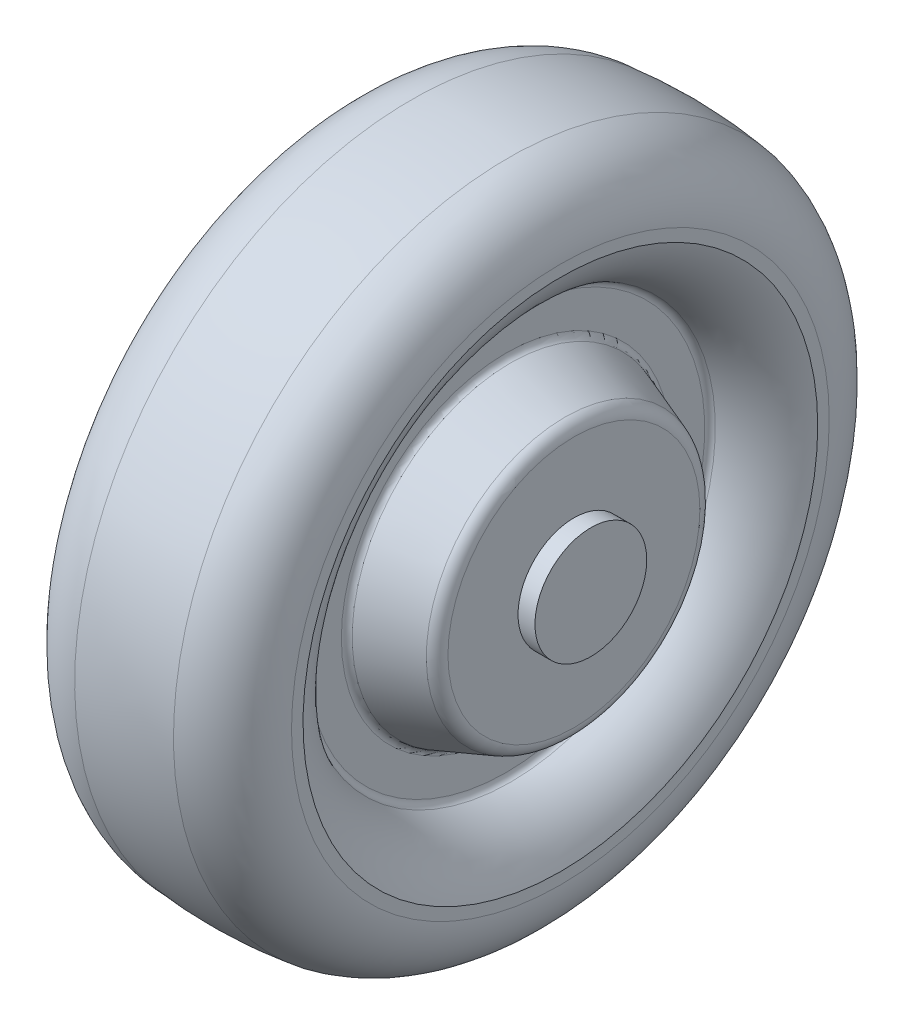
ISO-10303-21;
HEADER;
FILE_DESCRIPTION(('STEP AP214'),'2;1');
FILE_NAME('part.step','',(''),(''),'','','');
FILE_SCHEMA(('AUTOMOTIVE_DESIGN { 1 0 10303 214 1 1 1 1 }'));
ENDSEC;
DATA;
#1=APPLICATION_CONTEXT('core data for automotive mechanical design processes');
#2=APPLICATION_PROTOCOL_DEFINITION('international standard','automotive_design',2000,#1);
#3=PRODUCT_CONTEXT('',#1,'mechanical');
#4=PRODUCT('Part','Part','',(#3));
#5=PRODUCT_RELATED_PRODUCT_CATEGORY('part','',(#4));
#6=PRODUCT_DEFINITION_FORMATION('','',#4);
#7=PRODUCT_DEFINITION_CONTEXT('part definition',#1,'design');
#8=PRODUCT_DEFINITION('design','',#6,#7);
#9=PRODUCT_DEFINITION_SHAPE('','',#8);
#10=(LENGTH_UNIT() NAMED_UNIT(*) SI_UNIT(.MILLI.,.METRE.));
#11=(NAMED_UNIT(*) PLANE_ANGLE_UNIT() SI_UNIT($,.RADIAN.));
#12=(NAMED_UNIT(*) SI_UNIT($,.STERADIAN.) SOLID_ANGLE_UNIT());
#13=UNCERTAINTY_MEASURE_WITH_UNIT(LENGTH_MEASURE(1.E-05),#10,'distance_accuracy_value','');
#14=(GEOMETRIC_REPRESENTATION_CONTEXT(3) GLOBAL_UNCERTAINTY_ASSIGNED_CONTEXT((#13)) GLOBAL_UNIT_ASSIGNED_CONTEXT((#10,
#11,#12)) REPRESENTATION_CONTEXT('',''));
#15=CARTESIAN_POINT('',(0.,0.,0.));
#16=DIRECTION('',(0.,0.,1.));
#17=DIRECTION('',(1.,0.,0.));
#18=AXIS2_PLACEMENT_3D('',#15,#16,#17);
#19=CARTESIAN_POINT('',(20.5000021,0.,0.));
#20=DIRECTION('',(1.,0.,0.));
#21=DIRECTION('',(0.,0.,-1.));
#22=AXIS2_PLACEMENT_3D('',#19,#20,#21);
#23=PLANE('',#22);
#24=CARTESIAN_POINT('',(20.5000021,0.,0.));
#25=DIRECTION('',(1.,0.,0.));
#26=DIRECTION('',(0.,0.,-1.));
#27=AXIS2_PLACEMENT_3D('',#24,#25,#26);
#28=CIRCLE('',#27,8.25);
#29=CARTESIAN_POINT('',(20.5000021,0.,-8.25));
#30=VERTEX_POINT('',#29);
#31=EDGE_CURVE('E453',#30,#30,#28,.F.);
#32=ORIENTED_EDGE('',*,*,#31,.F.);
#33=EDGE_LOOP('',(#32));
#34=FACE_BOUND('',#33,.T.);
#35=ADVANCED_FACE('F17',(#34),#23,.T.);
#36=CARTESIAN_POINT('',(-22.55000231,0.,0.));
#37=DIRECTION('',(1.,0.,0.));
#38=DIRECTION('',(0.,0.,-1.));
#39=AXIS2_PLACEMENT_3D('',#36,#37,#38);
#40=CYLINDRICAL_SURFACE('',#39,8.25);
#41=ORIENTED_EDGE('',*,*,#31,.T.);
#42=EDGE_LOOP('',(#41));
#43=FACE_BOUND('',#42,.T.);
#44=CARTESIAN_POINT('',(18.0000021,0.,0.));
#45=DIRECTION('',(1.,0.,0.));
#46=DIRECTION('',(0.,0.,-1.));
#47=AXIS2_PLACEMENT_3D('',#44,#45,#46);
#48=CIRCLE('',#47,8.25);
#49=CARTESIAN_POINT('',(18.0000021,0.,-8.25));
#50=VERTEX_POINT('',#49);
#51=EDGE_CURVE('E87',#50,#50,#48,.F.);
#52=ORIENTED_EDGE('',*,*,#51,.F.);
#53=EDGE_LOOP('',(#52));
#54=FACE_BOUND('',#53,.T.);
#55=ADVANCED_FACE('F131',(#43,#54),#40,.T.);
#56=CARTESIAN_POINT('',(18.0000021,0.,0.));
#57=DIRECTION('',(1.,0.,0.));
#58=DIRECTION('',(0.,0.,-1.));
#59=AXIS2_PLACEMENT_3D('',#56,#57,#58);
#60=PLANE('',#59);
#61=ORIENTED_EDGE('',*,*,#51,.T.);
#62=EDGE_LOOP('',(#61));
#63=FACE_BOUND('',#62,.T.);
#64=CARTESIAN_POINT('',(18.000002100005,0.,0.));
#65=DIRECTION('',(-1.,0.,0.));
#66=DIRECTION('',(0.,-1.,0.));
#67=AXIS2_PLACEMENT_3D('',#64,#65,#66);
#68=CIRCLE('',#67,18.59927373273);
#69=CARTESIAN_POINT('',(18.000002100003,-18.59927373273,0.));
#70=VERTEX_POINT('',#69);
#71=CARTESIAN_POINT('',(18.000002100003,18.59927373273,0.));
#72=VERTEX_POINT('',#71);
#73=EDGE_CURVE('E85',#70,#72,#68,.T.);
#74=ORIENTED_EDGE('',*,*,#73,.F.);
#75=CARTESIAN_POINT('',(18.000002100005,0.,0.));
#76=DIRECTION('',(-1.,0.,0.));
#77=DIRECTION('',(0.,1.,0.));
#78=AXIS2_PLACEMENT_3D('',#75,#76,#77);
#79=CIRCLE('',#78,18.59927373273);
#80=EDGE_CURVE('E80',#72,#70,#79,.T.);
#81=ORIENTED_EDGE('',*,*,#80,.F.);
#82=EDGE_LOOP('',(#74,#81));
#83=FACE_BOUND('',#82,.T.);
#84=ADVANCED_FACE('F84',(#63,#83),#60,.T.);
#85=CARTESIAN_POINT('',(-20.5000021,0.,0.));
#86=DIRECTION('',(1.,0.,0.));
#87=DIRECTION('',(0.,0.,-1.));
#88=AXIS2_PLACEMENT_3D('',#85,#86,#87);
#89=PLANE('',#88);
#90=CARTESIAN_POINT('',(-20.5000021,0.,0.));
#91=DIRECTION('',(1.,0.,0.));
#92=DIRECTION('',(0.,0.,-1.));
#93=AXIS2_PLACEMENT_3D('',#90,#91,#92);
#94=CIRCLE('',#93,8.25);
#95=CARTESIAN_POINT('',(-20.5000021,0.,-8.25));
#96=VERTEX_POINT('',#95);
#97=EDGE_CURVE('E93',#96,#96,#94,.T.);
#98=ORIENTED_EDGE('',*,*,#97,.F.);
#99=EDGE_LOOP('',(#98));
#100=FACE_BOUND('',#99,.T.);
#101=ADVANCED_FACE('F114',(#100),#89,.F.);
#102=CARTESIAN_POINT('',(16.00000209975,0.,0.));
#103=DIRECTION('',(1.,0.,0.));
#104=DIRECTION('',(0.,-1.,0.));
#105=AXIS2_PLACEMENT_3D('',#102,#103,#104);
#106=TOROIDAL_SURFACE('',#105,18.59927373273,2.000000000255);
#107=ORIENTED_EDGE('',*,*,#80,.T.);
#108=ORIENTED_EDGE('',*,*,#73,.T.);
#109=EDGE_LOOP('',(#107,#108));
#110=FACE_BOUND('',#109,.T.);
#111=CARTESIAN_POINT('',(16.683649165698,0.,0.));
#112=DIRECTION('',(-1.,0.,0.));
#113=DIRECTION('',(0.,1.,0.));
#114=AXIS2_PLACEMENT_3D('',#111,#112,#113);
#115=CIRCLE('',#114,20.478802048642);
#116=CARTESIAN_POINT('',(16.683649165698,20.478802048642,0.));
#117=VERTEX_POINT('',#116);
#118=EDGE_CURVE('E119',#117,#117,#115,.T.);
#119=ORIENTED_EDGE('',*,*,#118,.F.);
#120=EDGE_LOOP('',(#119));
#121=FACE_BOUND('',#120,.T.);
#122=ADVANCED_FACE('F91',(#110,#121),#106,.T.);
#123=CARTESIAN_POINT('',(-22.55000231,0.,0.));
#124=DIRECTION('',(1.,0.,0.));
#125=DIRECTION('',(0.,0.,-1.));
#126=AXIS2_PLACEMENT_3D('',#123,#124,#125);
#127=CYLINDRICAL_SURFACE('',#126,8.25);
#128=ORIENTED_EDGE('',*,*,#97,.T.);
#129=EDGE_LOOP('',(#128));
#130=FACE_BOUND('',#129,.T.);
#131=CARTESIAN_POINT('',(-18.0000021,0.,0.));
#132=DIRECTION('',(1.,0.,0.));
#133=DIRECTION('',(0.,0.,-1.));
#134=AXIS2_PLACEMENT_3D('',#131,#132,#133);
#135=CIRCLE('',#134,8.25);
#136=CARTESIAN_POINT('',(-18.0000021,0.,-8.25));
#137=VERTEX_POINT('',#136);
#138=EDGE_CURVE('E439',#137,#137,#135,.F.);
#139=ORIENTED_EDGE('',*,*,#138,.T.);
#140=EDGE_LOOP('',(#139));
#141=FACE_BOUND('',#140,.T.);
#142=ADVANCED_FACE('F113',(#130,#141),#127,.T.);
#143=CARTESIAN_POINT('',(8.65817316699959,0.,0.));
#144=DIRECTION('',(-1.,0.,0.));
#145=DIRECTION('',(0.,0.,1.));
#146=AXIS2_PLACEMENT_3D('',#143,#144,#145);
#147=CONICAL_SURFACE('',#146,23.3979350430789,0.348856630041876);
#148=ORIENTED_EDGE('',*,*,#118,.T.);
#149=EDGE_LOOP('',(#148));
#150=FACE_BOUND('',#149,.T.);
#151=CARTESIAN_POINT('',(8.6581731670027,0.,0.));
#152=DIRECTION('',(1.,0.,0.));
#153=DIRECTION('',(0.,-1.,0.));
#154=AXIS2_PLACEMENT_3D('',#151,#152,#153);
#155=CIRCLE('',#154,23.3979350430874);
#156=CARTESIAN_POINT('',(8.6581731670027,-23.3979350430874,0.));
#157=VERTEX_POINT('',#156);
#158=EDGE_CURVE('E432',#157,#157,#155,.T.);
#159=ORIENTED_EDGE('',*,*,#158,.T.);
#160=EDGE_LOOP('',(#159));
#161=FACE_BOUND('',#160,.T.);
#162=ADVANCED_FACE('F418',(#150,#161),#147,.T.);
#163=CARTESIAN_POINT('',(-18.0000021,0.,0.));
#164=DIRECTION('',(1.,0.,0.));
#165=DIRECTION('',(0.,0.,-1.));
#166=AXIS2_PLACEMENT_3D('',#163,#164,#165);
#167=PLANE('',#166);
#168=ORIENTED_EDGE('',*,*,#138,.F.);
#169=EDGE_LOOP('',(#168));
#170=FACE_BOUND('',#169,.T.);
#171=CARTESIAN_POINT('',(-18.0000021,0.,0.));
#172=DIRECTION('',(1.,0.,0.));
#173=DIRECTION('',(0.,-1.,0.));
#174=AXIS2_PLACEMENT_3D('',#171,#172,#173);
#175=CIRCLE('',#174,18.59956475824);
#176=CARTESIAN_POINT('',(-18.0000021,-18.59956475824,0.));
#177=VERTEX_POINT('',#176);
#178=CARTESIAN_POINT('',(-18.0000021,18.59956475824,0.));
#179=VERTEX_POINT('',#178);
#180=EDGE_CURVE('E359',#177,#179,#175,.T.);
#181=ORIENTED_EDGE('',*,*,#180,.F.);
#182=CARTESIAN_POINT('',(-18.0000021,0.,0.));
#183=DIRECTION('',(1.,0.,0.));
#184=DIRECTION('',(0.,1.,0.));
#185=AXIS2_PLACEMENT_3D('',#182,#183,#184);
#186=CIRCLE('',#185,18.59956475824);
#187=EDGE_CURVE('E429',#179,#177,#186,.T.);
#188=ORIENTED_EDGE('',*,*,#187,.F.);
#189=EDGE_LOOP('',(#181,#188));
#190=FACE_BOUND('',#189,.T.);
#191=ADVANCED_FACE('F410',(#170,#190),#167,.F.);
#192=CARTESIAN_POINT('',(8.999996700315,0.,0.));
#193=DIRECTION('',(1.,0.,0.));
#194=DIRECTION('',(0.,-1.,0.));
#195=AXIS2_PLACEMENT_3D('',#192,#193,#194);
#196=TOROIDAL_SURFACE('',#195,24.33769920111,1.000000000315);
#197=ORIENTED_EDGE('',*,*,#158,.F.);
#198=EDGE_LOOP('',(#197));
#199=FACE_BOUND('',#198,.T.);
#200=CARTESIAN_POINT('',(7.9999967,0.,0.));
#201=DIRECTION('',(1.,0.,0.));
#202=DIRECTION('',(0.,1.,0.));
#203=AXIS2_PLACEMENT_3D('',#200,#201,#202);
#204=CIRCLE('',#203,24.33769920111);
#205=CARTESIAN_POINT('',(7.9999967,-24.33769920111,0.));
#206=VERTEX_POINT('',#205);
#207=CARTESIAN_POINT('',(7.9999967,24.33769920111,0.));
#208=VERTEX_POINT('',#207);
#209=EDGE_CURVE('E394',#206,#208,#204,.F.);
#210=ORIENTED_EDGE('',*,*,#209,.F.);
#211=CARTESIAN_POINT('',(7.9999967,0.,0.));
#212=DIRECTION('',(1.,0.,0.));
#213=DIRECTION('',(0.,-1.,0.));
#214=AXIS2_PLACEMENT_3D('',#211,#212,#213);
#215=CIRCLE('',#214,24.33769920111);
#216=EDGE_CURVE('E515',#208,#206,#215,.F.);
#217=ORIENTED_EDGE('',*,*,#216,.F.);
#218=EDGE_LOOP('',(#210,#217));
#219=FACE_BOUND('',#218,.T.);
#220=ADVANCED_FACE('F377',(#199,#219),#196,.F.);
#221=CARTESIAN_POINT('',(-16.00000209963,0.,0.));
#222=DIRECTION('',(1.,0.,0.));
#223=DIRECTION('',(0.,-1.,0.));
#224=AXIS2_PLACEMENT_3D('',#221,#222,#223);
#225=TOROIDAL_SURFACE('',#224,18.59956475824,2.00000000037);
#226=CARTESIAN_POINT('',(-16.6840439790899,0.,0.));
#227=DIRECTION('',(1.,0.,0.));
#228=DIRECTION('',(0.,-1.,0.));
#229=AXIS2_PLACEMENT_3D('',#226,#227,#228);
#230=CIRCLE('',#229,20.4789494204699);
#231=CARTESIAN_POINT('',(-16.6840439790899,-20.4789494204699,0.));
#232=VERTEX_POINT('',#231);
#233=EDGE_CURVE('E387',#232,#232,#230,.T.);
#234=ORIENTED_EDGE('',*,*,#233,.F.);
#235=EDGE_LOOP('',(#234));
#236=FACE_BOUND('',#235,.T.);
#237=ORIENTED_EDGE('',*,*,#187,.T.);
#238=ORIENTED_EDGE('',*,*,#180,.T.);
#239=EDGE_LOOP('',(#237,#238));
#240=FACE_BOUND('',#239,.T.);
#241=ADVANCED_FACE('F365',(#236,#240),#225,.T.);
#242=CARTESIAN_POINT('',(7.9999967,0.,0.));
#243=DIRECTION('',(1.,0.,0.));
#244=DIRECTION('',(0.,0.,-1.));
#245=AXIS2_PLACEMENT_3D('',#242,#243,#244);
#246=PLANE('',#245);
#247=ORIENTED_EDGE('',*,*,#216,.T.);
#248=ORIENTED_EDGE('',*,*,#209,.T.);
#249=EDGE_LOOP('',(#247,#248));
#250=FACE_BOUND('',#249,.T.);
#251=CARTESIAN_POINT('',(7.99999669999973,0.,0.));
#252=DIRECTION('',(-1.,0.,0.));
#253=DIRECTION('',(0.,-1.,0.));
#254=AXIS2_PLACEMENT_3D('',#251,#252,#253);
#255=CIRCLE('',#254,29.31346243683);
#256=CARTESIAN_POINT('',(7.99999669999974,29.31346254945,0.));
#257=VERTEX_POINT('',#256);
#258=CARTESIAN_POINT('',(7.99999669999974,-29.31346254945,0.));
#259=VERTEX_POINT('',#258);
#260=EDGE_CURVE('E490',#257,#259,#255,.F.);
#261=ORIENTED_EDGE('',*,*,#260,.T.);
#262=CARTESIAN_POINT('',(7.99999669999973,0.,0.));
#263=DIRECTION('',(-1.,0.,0.));
#264=DIRECTION('',(0.,1.,0.));
#265=AXIS2_PLACEMENT_3D('',#262,#263,#264);
#266=CIRCLE('',#265,29.31346243683);
#267=EDGE_CURVE('E346',#259,#257,#266,.F.);
#268=ORIENTED_EDGE('',*,*,#267,.T.);
#269=EDGE_LOOP('',(#261,#268));
#270=FACE_BOUND('',#269,.T.);
#271=ADVANCED_FACE('F376',(#250,#270),#246,.T.);
#272=CARTESIAN_POINT('',(-8.66361456060949,0.,0.));
#273=DIRECTION('',(1.,0.,0.));
#274=DIRECTION('',(0.,0.,-1.));
#275=AXIS2_PLACEMENT_3D('',#272,#273,#274);
#276=CONICAL_SURFACE('',#275,23.3981546897103,0.349066697579001);
#277=CARTESIAN_POINT('',(-8.66361456061323,0.,0.));
#278=DIRECTION('',(1.,0.,0.));
#279=DIRECTION('',(0.,-1.,0.));
#280=AXIS2_PLACEMENT_3D('',#277,#278,#279);
#281=CIRCLE('',#280,23.3981546897206);
#282=CARTESIAN_POINT('',(-8.66361456061323,-23.3981546897206,0.));
#283=VERTEX_POINT('',#282);
#284=EDGE_CURVE('E487',#283,#283,#281,.F.);
#285=ORIENTED_EDGE('',*,*,#284,.T.);
#286=EDGE_LOOP('',(#285));
#287=FACE_BOUND('',#286,.T.);
#288=ORIENTED_EDGE('',*,*,#233,.T.);
#289=EDGE_LOOP('',(#288));
#290=FACE_BOUND('',#289,.T.);
#291=ADVANCED_FACE('F544',(#287,#290),#276,.T.);
#292=CARTESIAN_POINT('',(8.99999304697,0.,0.));
#293=DIRECTION('',(1.,0.,0.));
#294=DIRECTION('',(0.,-1.,0.));
#295=AXIS2_PLACEMENT_3D('',#292,#293,#294);
#296=TOROIDAL_SURFACE('',#295,29.31346356303,0.9999963469709);
#297=ORIENTED_EDGE('',*,*,#260,.F.);
#298=ORIENTED_EDGE('',*,*,#267,.F.);
#299=EDGE_LOOP('',(#297,#298));
#300=FACE_BOUND('',#299,.T.);
#301=CARTESIAN_POINT('',(8.63407513348232,0.,0.));
#302=DIRECTION('',(1.,0.,0.));
#303=DIRECTION('',(0.,-1.,0.));
#304=AXIS2_PLACEMENT_3D('',#301,#302,#303);
#305=CIRCLE('',#304,30.2441067677817);
#306=CARTESIAN_POINT('',(8.63407513348232,-30.2441067677817,0.));
#307=VERTEX_POINT('',#306);
#308=EDGE_CURVE('E485',#307,#307,#305,.F.);
#309=ORIENTED_EDGE('',*,*,#308,.F.);
#310=EDGE_LOOP('',(#309));
#311=FACE_BOUND('',#310,.T.);
#312=ADVANCED_FACE('F321',(#300,#311),#296,.F.);
#313=CARTESIAN_POINT('',(-9.005635498938,0.,0.));
#314=DIRECTION('',(1.,0.,0.));
#315=DIRECTION('',(0.,-1.,0.));
#316=AXIS2_PLACEMENT_3D('',#313,#314,#315);
#317=TOROIDAL_SURFACE('',#316,24.33784702002,0.999999998938);
#318=CARTESIAN_POINT('',(-8.0056355,0.,0.));
#319=DIRECTION('',(-1.,0.,0.));
#320=DIRECTION('',(0.,-1.,0.));
#321=AXIS2_PLACEMENT_3D('',#318,#319,#320);
#322=CIRCLE('',#321,24.337847020185);
#323=CARTESIAN_POINT('',(-8.0056355,-24.337847020251,0.));
#324=VERTEX_POINT('',#323);
#325=CARTESIAN_POINT('',(-8.0056355,24.337847020251,0.));
#326=VERTEX_POINT('',#325);
#327=EDGE_CURVE('E290',#324,#326,#322,.T.);
#328=ORIENTED_EDGE('',*,*,#327,.T.);
#329=CARTESIAN_POINT('',(-8.0056355,0.,0.));
#330=DIRECTION('',(-1.,0.,0.));
#331=DIRECTION('',(0.,1.,0.));
#332=AXIS2_PLACEMENT_3D('',#329,#330,#331);
#333=CIRCLE('',#332,24.337847020185);
#334=EDGE_CURVE('E280',#326,#324,#333,.T.);
#335=ORIENTED_EDGE('',*,*,#334,.T.);
#336=EDGE_LOOP('',(#328,#335));
#337=FACE_BOUND('',#336,.T.);
#338=ORIENTED_EDGE('',*,*,#284,.F.);
#339=EDGE_LOOP('',(#338));
#340=FACE_BOUND('',#339,.T.);
#341=ADVANCED_FACE('F316',(#337,#340),#317,.F.);
#342=CARTESIAN_POINT('',(4.0056355,0.,0.));
#343=DIRECTION('',(1.,0.,0.));
#344=DIRECTION('',(0.,-1.,0.));
#345=AXIS2_PLACEMENT_3D('',#342,#343,#344);
#346=TOROIDAL_SURFACE('',#345,42.01556683011,12.6487044965);
#347=ORIENTED_EDGE('',*,*,#308,.T.);
#348=EDGE_LOOP('',(#347));
#349=FACE_BOUND('',#348,.T.);
#350=CARTESIAN_POINT('',(16.0000071,0.,0.));
#351=DIRECTION('',(1.,0.,0.));
#352=DIRECTION('',(0.,0.,-1.));
#353=AXIS2_PLACEMENT_3D('',#350,#351,#352);
#354=CIRCLE('',#353,38.000000199995);
#355=CARTESIAN_POINT('',(16.0000071,0.,-38.000000199995));
#356=VERTEX_POINT('',#355);
#357=EDGE_CURVE('E448',#356,#356,#354,.F.);
#358=ORIENTED_EDGE('',*,*,#357,.F.);
#359=EDGE_LOOP('',(#358));
#360=FACE_BOUND('',#359,.T.);
#361=ADVANCED_FACE('F313',(#349,#360),#346,.T.);
#362=CARTESIAN_POINT('',(-8.0056355,0.,0.));
#363=DIRECTION('',(1.,0.,0.));
#364=DIRECTION('',(0.,0.,-1.));
#365=AXIS2_PLACEMENT_3D('',#362,#363,#364);
#366=PLANE('',#365);
#367=ORIENTED_EDGE('',*,*,#334,.F.);
#368=ORIENTED_EDGE('',*,*,#327,.F.);
#369=EDGE_LOOP('',(#367,#368));
#370=FACE_BOUND('',#369,.T.);
#371=CARTESIAN_POINT('',(-8.005635499996,0.,0.));
#372=DIRECTION('',(1.,0.,0.));
#373=DIRECTION('',(0.,1.,0.));
#374=AXIS2_PLACEMENT_3D('',#371,#372,#373);
#375=CIRCLE('',#374,29.31567338417);
#376=CARTESIAN_POINT('',(-8.0056354999976,-29.31567338417,0.));
#377=VERTEX_POINT('',#376);
#378=CARTESIAN_POINT('',(-8.0056354999976,29.31567338417,0.));
#379=VERTEX_POINT('',#378);
#380=EDGE_CURVE('E256',#377,#379,#375,.F.);
#381=ORIENTED_EDGE('',*,*,#380,.T.);
#382=CARTESIAN_POINT('',(-8.005635499996,0.,0.));
#383=DIRECTION('',(1.,0.,0.));
#384=DIRECTION('',(0.,-1.,0.));
#385=AXIS2_PLACEMENT_3D('',#382,#383,#384);
#386=CIRCLE('',#385,29.31567338417);
#387=EDGE_CURVE('E267',#379,#377,#386,.F.);
#388=ORIENTED_EDGE('',*,*,#387,.T.);
#389=EDGE_LOOP('',(#381,#388));
#390=FACE_BOUND('',#389,.T.);
#391=ADVANCED_FACE('F231',(#370,#390),#366,.F.);
#392=CARTESIAN_POINT('',(16.0000071,0.,0.));
#393=DIRECTION('',(1.,0.,0.));
#394=DIRECTION('',(0.,0.,-1.));
#395=AXIS2_PLACEMENT_3D('',#392,#393,#394);
#396=PLANE('',#395);
#397=ORIENTED_EDGE('',*,*,#357,.T.);
#398=EDGE_LOOP('',(#397));
#399=FACE_BOUND('',#398,.T.);
#400=CARTESIAN_POINT('',(15.999981699999,0.,0.));
#401=DIRECTION('',(-1.,0.,0.));
#402=DIRECTION('',(0.,1.,0.));
#403=AXIS2_PLACEMENT_3D('',#400,#401,#402);
#404=CIRCLE('',#403,39.69656780002);
#405=CARTESIAN_POINT('',(15.9999943999995,39.69656780002,0.));
#406=VERTEX_POINT('',#405);
#407=CARTESIAN_POINT('',(15.9999943198706,-39.696568394557,0.));
#408=VERTEX_POINT('',#407);
#409=EDGE_CURVE('E211',#406,#408,#404,.T.);
#410=ORIENTED_EDGE('',*,*,#409,.F.);
#411=CARTESIAN_POINT('',(15.999981699999,0.,0.));
#412=DIRECTION('',(-1.,0.,0.));
#413=DIRECTION('',(0.,-1.,0.));
#414=AXIS2_PLACEMENT_3D('',#411,#412,#413);
#415=CIRCLE('',#414,39.69656780002);
#416=EDGE_CURVE('E466',#408,#406,#415,.T.);
#417=ORIENTED_EDGE('',*,*,#416,.F.);
#418=EDGE_LOOP('',(#410,#417));
#419=FACE_BOUND('',#418,.T.);
#420=ADVANCED_FACE('F222',(#399,#419),#396,.T.);
#421=CARTESIAN_POINT('',(-9.005644698253,0.,0.));
#422=DIRECTION('',(1.,0.,0.));
#423=DIRECTION('',(0.,-1.,0.));
#424=AXIS2_PLACEMENT_3D('',#421,#422,#423);
#425=TOROIDAL_SURFACE('',#424,29.31567338417,1.000009198257);
#426=ORIENTED_EDGE('',*,*,#387,.F.);
#427=ORIENTED_EDGE('',*,*,#380,.F.);
#428=EDGE_LOOP('',(#426,#427));
#429=FACE_BOUND('',#428,.T.);
#430=CARTESIAN_POINT('',(-8.6392966443877,0.,0.));
#431=DIRECTION('',(1.,0.,0.));
#432=DIRECTION('',(0.,-1.,0.));
#433=AXIS2_PLACEMENT_3D('',#430,#431,#432);
#434=CIRCLE('',#433,30.2461611595262);
#435=CARTESIAN_POINT('',(-8.6392966443877,-30.2461611595262,0.));
#436=VERTEX_POINT('',#435);
#437=EDGE_CURVE('E209',#436,#436,#434,.T.);
#438=ORIENTED_EDGE('',*,*,#437,.F.);
#439=EDGE_LOOP('',(#438));
#440=FACE_BOUND('',#439,.T.);
#441=ADVANCED_FACE('F200',(#429,#440),#425,.F.);
#442=CARTESIAN_POINT('',(5.999981272082,0.,0.));
#443=DIRECTION('',(1.,0.,0.));
#444=DIRECTION('',(0.,-1.,0.));
#445=AXIS2_PLACEMENT_3D('',#442,#443,#444);
#446=TOROIDAL_SURFACE('',#445,39.6965755039,10.00000042792);
#447=CARTESIAN_POINT('',(8.30311651308732,0.,1.07702475410365E-11));
#448=DIRECTION('',(-1.,0.,0.));
#449=DIRECTION('',(0.,-0.998026728428285,0.0627905195290935));
#450=AXIS2_PLACEMENT_3D('',#447,#448,#449);
#451=CIRCLE('',#450,49.4277407280683);
#452=CARTESIAN_POINT('',(8.3031165130874,-49.3302063724355,3.10359351947551));
#453=VERTEX_POINT('',#452);
#454=EDGE_CURVE('E190',#453,#453,#451,.T.);
#455=ORIENTED_EDGE('',*,*,#454,.F.);
#456=EDGE_LOOP('',(#455));
#457=FACE_BOUND('',#456,.T.);
#458=ORIENTED_EDGE('',*,*,#409,.T.);
#459=ORIENTED_EDGE('',*,*,#416,.T.);
#460=EDGE_LOOP('',(#458,#459));
#461=FACE_BOUND('',#460,.T.);
#462=ADVANCED_FACE('F195',(#457,#461),#446,.T.);
#463=CARTESIAN_POINT('',(-4.0056355,0.,0.));
#464=DIRECTION('',(1.,0.,0.));
#465=DIRECTION('',(0.,-1.,0.));
#466=AXIS2_PLACEMENT_3D('',#463,#464,#465);
#467=TOROIDAL_SURFACE('',#466,42.01556683011,12.6487044965);
#468=ORIENTED_EDGE('',*,*,#437,.T.);
#469=EDGE_LOOP('',(#468));
#470=FACE_BOUND('',#469,.T.);
#471=CARTESIAN_POINT('',(-16.0000071,0.,0.));
#472=DIRECTION('',(1.,0.,0.));
#473=DIRECTION('',(0.,0.,-1.));
#474=AXIS2_PLACEMENT_3D('',#471,#472,#473);
#475=CIRCLE('',#474,38.000000199995);
#476=CARTESIAN_POINT('',(-16.0000071,0.,-38.000000199995));
#477=VERTEX_POINT('',#476);
#478=EDGE_CURVE('E101',#477,#477,#475,.F.);
#479=ORIENTED_EDGE('',*,*,#478,.T.);
#480=EDGE_LOOP('',(#479));
#481=FACE_BOUND('',#480,.T.);
#482=ADVANCED_FACE('F192',(#470,#481),#467,.T.);
#483=CARTESIAN_POINT('',(1.30023981003488E-05,0.,-3.95430216348913E-12));
#484=DIRECTION('',(1.,0.,0.));
#485=DIRECTION('',(0.,1.,0.));
#486=AXIS2_PLACEMENT_3D('',#483,#484,#485);
#487=DEGENERATE_TOROIDAL_SURFACE('',#486,11.43738314255,61.4288599250736,.F.);
#488=CARTESIAN_POINT('',(-6.01203892659301,0.,0.));
#489=DIRECTION('',(1.,0.,0.));
#490=DIRECTION('',(0.,-1.,0.));
#491=AXIS2_PLACEMENT_3D('',#488,#489,#490);
#492=CIRCLE('',#491,49.6965686624661);
#493=CARTESIAN_POINT('',(-6.01203892659301,-49.6965686624661,0.));
#494=VERTEX_POINT('',#493);
#495=EDGE_CURVE('E29',#494,#494,#492,.F.);
#496=ORIENTED_EDGE('',*,*,#495,.F.);
#497=EDGE_LOOP('',(#496));
#498=FACE_BOUND('',#497,.T.);
#499=ORIENTED_EDGE('',*,*,#454,.T.);
#500=EDGE_LOOP('',(#499));
#501=FACE_BOUND('',#500,.T.);
#502=ADVANCED_FACE('F19',(#498,#501),#487,.F.);
#503=CARTESIAN_POINT('',(-16.0000071,0.,0.));
#504=DIRECTION('',(1.,0.,0.));
#505=DIRECTION('',(0.,0.,-1.));
#506=AXIS2_PLACEMENT_3D('',#503,#504,#505);
#507=PLANE('',#506);
#508=ORIENTED_EDGE('',*,*,#478,.F.);
#509=EDGE_LOOP('',(#508));
#510=FACE_BOUND('',#509,.T.);
#511=CARTESIAN_POINT('',(-15.999981699999,0.,0.));
#512=DIRECTION('',(1.,0.,0.));
#513=DIRECTION('',(0.,-1.,0.));
#514=AXIS2_PLACEMENT_3D('',#511,#512,#513);
#515=CIRCLE('',#514,39.69656780002);
#516=CARTESIAN_POINT('',(-15.9999943999995,-39.69656780002,0.));
#517=VERTEX_POINT('',#516);
#518=CARTESIAN_POINT('',(-15.9999943198706,39.696568394557,0.));
#519=VERTEX_POINT('',#518);
#520=EDGE_CURVE('E11',#517,#519,#515,.T.);
#521=ORIENTED_EDGE('',*,*,#520,.F.);
#522=CARTESIAN_POINT('',(-15.999981699999,0.,0.));
#523=DIRECTION('',(1.,0.,0.));
#524=DIRECTION('',(0.,1.,0.));
#525=AXIS2_PLACEMENT_3D('',#522,#523,#524);
#526=CIRCLE('',#525,39.69656780002);
#527=EDGE_CURVE('E36',#519,#517,#526,.T.);
#528=ORIENTED_EDGE('',*,*,#527,.F.);
#529=EDGE_LOOP('',(#521,#528));
#530=FACE_BOUND('',#529,.T.);
#531=ADVANCED_FACE('F144',(#510,#530),#507,.F.);
#532=CARTESIAN_POINT('',(-5.999981272082,0.,0.));
#533=DIRECTION('',(1.,0.,0.));
#534=DIRECTION('',(0.,-1.,0.));
#535=AXIS2_PLACEMENT_3D('',#532,#533,#534);
#536=TOROIDAL_SURFACE('',#535,39.6965755039,10.00000042792);
#537=ORIENTED_EDGE('',*,*,#527,.T.);
#538=ORIENTED_EDGE('',*,*,#520,.T.);
#539=EDGE_LOOP('',(#537,#538));
#540=FACE_BOUND('',#539,.T.);
#541=ORIENTED_EDGE('',*,*,#495,.T.);
#542=EDGE_LOOP('',(#541));
#543=FACE_BOUND('',#542,.T.);
#544=ADVANCED_FACE('F142',(#540,#543),#536,.T.);
#545=CLOSED_SHELL('',(#35,#55,#84,#101,#122,#142,#162,#191,#220,#241,#271,#291,#312,#341,#361,
#391,#420,#441,#462,#482,#502,#531,#544));
#546=MANIFOLD_SOLID_BREP('B1',#545);
#547=ADVANCED_BREP_SHAPE_REPRESENTATION('',(#18,#546),#14);
#548=SHAPE_DEFINITION_REPRESENTATION(#9,#547);
ENDSEC;
END-ISO-10303-21;
